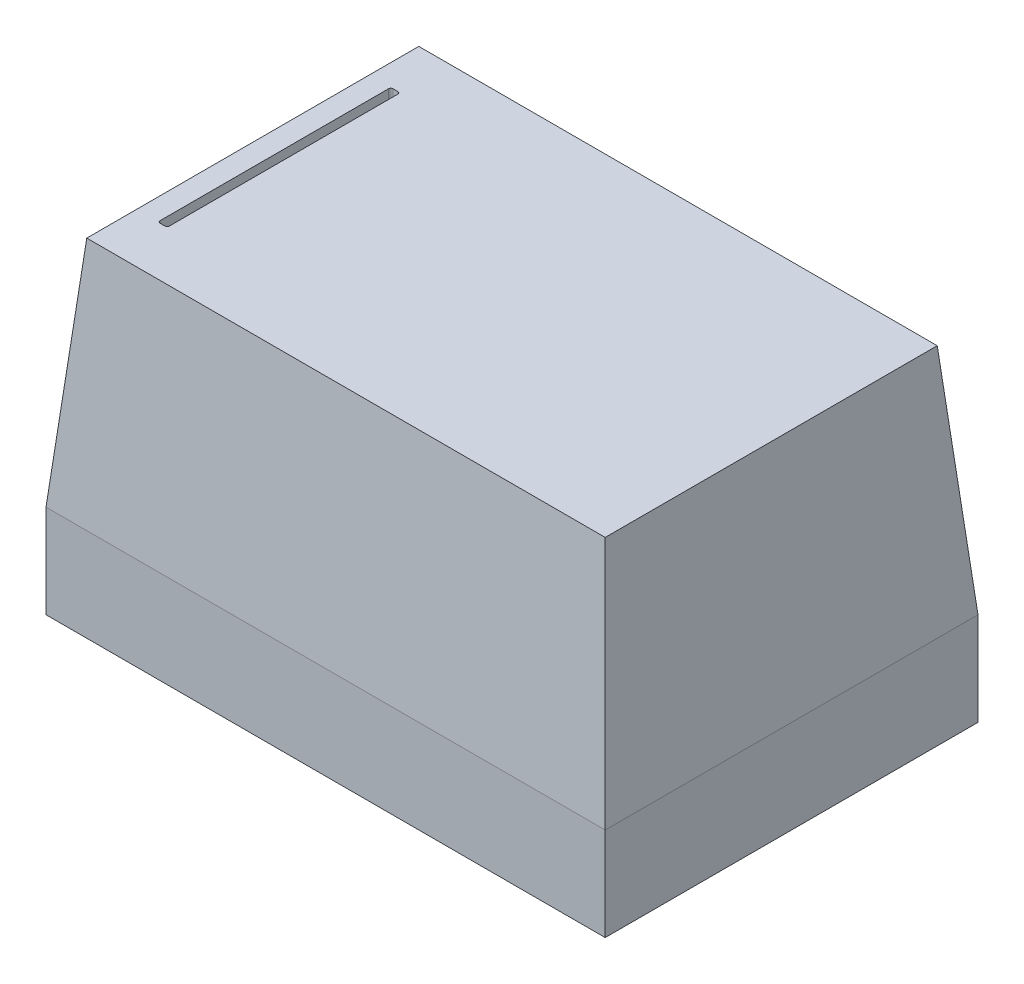
ISO-10303-21;
HEADER;
FILE_DESCRIPTION(('STEP AP214'),'2;1');
FILE_NAME('part.step','',(''),(''),'','','');
FILE_SCHEMA(('AUTOMOTIVE_DESIGN { 1 0 10303 214 1 1 1 1 }'));
ENDSEC;
DATA;
#1=APPLICATION_CONTEXT('core data for automotive mechanical design processes');
#2=APPLICATION_PROTOCOL_DEFINITION('international standard','automotive_design',2000,#1);
#3=PRODUCT_CONTEXT('',#1,'mechanical');
#4=PRODUCT('Part','Part','',(#3));
#5=PRODUCT_RELATED_PRODUCT_CATEGORY('part','',(#4));
#6=PRODUCT_DEFINITION_FORMATION('','',#4);
#7=PRODUCT_DEFINITION_CONTEXT('part definition',#1,'design');
#8=PRODUCT_DEFINITION('design','',#6,#7);
#9=PRODUCT_DEFINITION_SHAPE('','',#8);
#10=(LENGTH_UNIT() NAMED_UNIT(*) SI_UNIT(.MILLI.,.METRE.));
#11=(NAMED_UNIT(*) PLANE_ANGLE_UNIT() SI_UNIT($,.RADIAN.));
#12=(NAMED_UNIT(*) SI_UNIT($,.STERADIAN.) SOLID_ANGLE_UNIT());
#13=UNCERTAINTY_MEASURE_WITH_UNIT(LENGTH_MEASURE(1.E-05),#10,'distance_accuracy_value','');
#14=(GEOMETRIC_REPRESENTATION_CONTEXT(3) GLOBAL_UNCERTAINTY_ASSIGNED_CONTEXT((#13)) GLOBAL_UNIT_ASSIGNED_CONTEXT((#10,
#11,#12)) REPRESENTATION_CONTEXT('',''));
#15=CARTESIAN_POINT('',(0.,0.,0.));
#16=DIRECTION('',(0.,0.,1.));
#17=DIRECTION('',(1.,0.,0.));
#18=AXIS2_PLACEMENT_3D('',#15,#16,#17);
#19=CARTESIAN_POINT('',(-0.495,0.65,0.245));
#20=DIRECTION('',(0.,1.,0.));
#21=DIRECTION('',(0.,0.,1.));
#22=AXIS2_PLACEMENT_3D('',#19,#20,#21);
#23=PLANE('',#22);
#24=CARTESIAN_POINT('',(-0.505,0.65,0.245));
#25=DIRECTION('',(0.,1.,0.));
#26=DIRECTION('',(0.,0.,1.));
#27=AXIS2_PLACEMENT_3D('',#24,#25,#26);
#28=CIRCLE('',#27,0.005);
#29=CARTESIAN_POINT('',(-0.51,0.65,0.245));
#30=VERTEX_POINT('',#29);
#31=CARTESIAN_POINT('',(-0.505,0.65,0.25));
#32=VERTEX_POINT('',#31);
#33=EDGE_CURVE('E132',#30,#32,#28,.T.);
#34=ORIENTED_EDGE('',*,*,#33,.T.);
#35=DIRECTION('',(1.,0.,0.));
#36=VECTOR('',#35,1.);
#37=CARTESIAN_POINT('',(-0.505,0.65,0.25));
#38=LINE('',#37,#36);
#39=CARTESIAN_POINT('',(-0.495,0.65,0.25));
#40=VERTEX_POINT('',#39);
#41=EDGE_CURVE('E126',#32,#40,#38,.T.);
#42=ORIENTED_EDGE('',*,*,#41,.T.);
#43=CARTESIAN_POINT('',(-0.495,0.65,0.245));
#44=DIRECTION('',(0.,1.,0.));
#45=DIRECTION('',(0.,0.,1.));
#46=AXIS2_PLACEMENT_3D('',#43,#44,#45);
#47=CIRCLE('',#46,0.005);
#48=CARTESIAN_POINT('',(-0.49,0.65,0.245));
#49=VERTEX_POINT('',#48);
#50=EDGE_CURVE('E20',#40,#49,#47,.T.);
#51=ORIENTED_EDGE('',*,*,#50,.T.);
#52=DIRECTION('',(0.,0.,-1.));
#53=VECTOR('',#52,1.);
#54=CARTESIAN_POINT('',(-0.49,0.65,-0.245));
#55=LINE('',#54,#53);
#56=CARTESIAN_POINT('',(-0.49,0.65,-0.245));
#57=VERTEX_POINT('',#56);
#58=EDGE_CURVE('E168',#49,#57,#55,.T.);
#59=ORIENTED_EDGE('',*,*,#58,.T.);
#60=CARTESIAN_POINT('',(-0.495,0.65,-0.245));
#61=DIRECTION('',(0.,1.,0.));
#62=DIRECTION('',(0.,0.,1.));
#63=AXIS2_PLACEMENT_3D('',#60,#61,#62);
#64=CIRCLE('',#63,0.005);
#65=CARTESIAN_POINT('',(-0.495,0.65,-0.25));
#66=VERTEX_POINT('',#65);
#67=EDGE_CURVE('E153',#57,#66,#64,.T.);
#68=ORIENTED_EDGE('',*,*,#67,.T.);
#69=DIRECTION('',(-1.,0.,0.));
#70=VECTOR('',#69,1.);
#71=CARTESIAN_POINT('',(-0.505,0.65,-0.25));
#72=LINE('',#71,#70);
#73=CARTESIAN_POINT('',(-0.505,0.65,-0.25));
#74=VERTEX_POINT('',#73);
#75=EDGE_CURVE('E169',#66,#74,#72,.T.);
#76=ORIENTED_EDGE('',*,*,#75,.T.);
#77=CARTESIAN_POINT('',(-0.505,0.65,-0.245));
#78=DIRECTION('',(0.,1.,0.));
#79=DIRECTION('',(0.,0.,1.));
#80=AXIS2_PLACEMENT_3D('',#77,#78,#79);
#81=CIRCLE('',#80,0.005);
#82=CARTESIAN_POINT('',(-0.51,0.65,-0.245));
#83=VERTEX_POINT('',#82);
#84=EDGE_CURVE('E158',#74,#83,#81,.T.);
#85=ORIENTED_EDGE('',*,*,#84,.T.);
#86=DIRECTION('',(0.,0.,1.));
#87=VECTOR('',#86,1.);
#88=CARTESIAN_POINT('',(-0.51,0.65,-0.245));
#89=LINE('',#88,#87);
#90=EDGE_CURVE('E139',#83,#30,#89,.T.);
#91=ORIENTED_EDGE('',*,*,#90,.T.);
#92=EDGE_LOOP('',(#34,#42,#51,#59,#68,#76,#85,#91));
#93=FACE_BOUND('',#92,.T.);
#94=ADVANCED_FACE('F17',(#93),#23,.T.);
#95=CARTESIAN_POINT('',(-0.495,0.65,0.245));
#96=DIRECTION('',(0.,1.,0.));
#97=DIRECTION('',(0.,0.,1.));
#98=AXIS2_PLACEMENT_3D('',#95,#96,#97);
#99=CYLINDRICAL_SURFACE('',#98,0.005);
#100=DIRECTION('',(0.,1.,0.));
#101=VECTOR('',#100,1.);
#102=CARTESIAN_POINT('',(-0.49,0.65,0.245));
#103=LINE('',#102,#101);
#104=CARTESIAN_POINT('',(-0.49,0.7,0.245));
#105=VERTEX_POINT('',#104);
#106=EDGE_CURVE('E121',#105,#49,#103,.F.);
#107=ORIENTED_EDGE('',*,*,#106,.T.);
#108=ORIENTED_EDGE('',*,*,#50,.F.);
#109=DIRECTION('',(0.,1.,0.));
#110=VECTOR('',#109,1.);
#111=CARTESIAN_POINT('',(-0.495,0.65,0.25));
#112=LINE('',#111,#110);
#113=CARTESIAN_POINT('',(-0.495,0.7,0.25));
#114=VERTEX_POINT('',#113);
#115=EDGE_CURVE('E119',#40,#114,#112,.T.);
#116=ORIENTED_EDGE('',*,*,#115,.T.);
#117=CARTESIAN_POINT('',(-0.495,0.7,0.245));
#118=DIRECTION('',(0.,1.,0.));
#119=DIRECTION('',(0.,0.,1.));
#120=AXIS2_PLACEMENT_3D('',#117,#118,#119);
#121=CIRCLE('',#120,0.005);
#122=EDGE_CURVE('E150',#105,#114,#121,.F.);
#123=ORIENTED_EDGE('',*,*,#122,.F.);
#124=EDGE_LOOP('',(#107,#108,#116,#123));
#125=FACE_BOUND('',#124,.T.);
#126=ADVANCED_FACE('F117',(#125),#99,.F.);
#127=CARTESIAN_POINT('',(-0.505,0.65,0.25));
#128=DIRECTION('',(0.,0.,1.));
#129=DIRECTION('',(1.,0.,0.));
#130=AXIS2_PLACEMENT_3D('',#127,#128,#129);
#131=PLANE('',#130);
#132=ORIENTED_EDGE('',*,*,#115,.F.);
#133=ORIENTED_EDGE('',*,*,#41,.F.);
#134=DIRECTION('',(0.,1.,0.));
#135=VECTOR('',#134,1.);
#136=CARTESIAN_POINT('',(-0.505,0.65,0.25));
#137=LINE('',#136,#135);
#138=CARTESIAN_POINT('',(-0.505,0.7,0.25));
#139=VERTEX_POINT('',#138);
#140=EDGE_CURVE('E162',#32,#139,#137,.T.);
#141=ORIENTED_EDGE('',*,*,#140,.T.);
#142=DIRECTION('',(1.,0.,0.));
#143=VECTOR('',#142,1.);
#144=CARTESIAN_POINT('',(0.,0.7,0.25));
#145=LINE('',#144,#143);
#146=EDGE_CURVE('E131',#114,#139,#145,.F.);
#147=ORIENTED_EDGE('',*,*,#146,.F.);
#148=EDGE_LOOP('',(#132,#133,#141,#147));
#149=FACE_BOUND('',#148,.T.);
#150=ADVANCED_FACE('F128',(#149),#131,.F.);
#151=CARTESIAN_POINT('',(-0.505,0.65,0.245));
#152=DIRECTION('',(0.,1.,0.));
#153=DIRECTION('',(0.,0.,1.));
#154=AXIS2_PLACEMENT_3D('',#151,#152,#153);
#155=CYLINDRICAL_SURFACE('',#154,0.005);
#156=ORIENTED_EDGE('',*,*,#140,.F.);
#157=ORIENTED_EDGE('',*,*,#33,.F.);
#158=DIRECTION('',(0.,1.,0.));
#159=VECTOR('',#158,1.);
#160=CARTESIAN_POINT('',(-0.51,0.65,0.245));
#161=LINE('',#160,#159);
#162=CARTESIAN_POINT('',(-0.51,0.7,0.245));
#163=VERTEX_POINT('',#162);
#164=EDGE_CURVE('E161',#30,#163,#161,.T.);
#165=ORIENTED_EDGE('',*,*,#164,.T.);
#166=CARTESIAN_POINT('',(-0.505,0.7,0.245));
#167=DIRECTION('',(0.,1.,0.));
#168=DIRECTION('',(0.,0.,1.));
#169=AXIS2_PLACEMENT_3D('',#166,#167,#168);
#170=CIRCLE('',#169,0.005);
#171=EDGE_CURVE('E148',#139,#163,#170,.F.);
#172=ORIENTED_EDGE('',*,*,#171,.F.);
#173=EDGE_LOOP('',(#156,#157,#165,#172));
#174=FACE_BOUND('',#173,.T.);
#175=ADVANCED_FACE('F303',(#174),#155,.F.);
#176=CARTESIAN_POINT('',(-0.51,0.65,-0.245));
#177=DIRECTION('',(-1.,0.,0.));
#178=DIRECTION('',(0.,0.,1.));
#179=AXIS2_PLACEMENT_3D('',#176,#177,#178);
#180=PLANE('',#179);
#181=ORIENTED_EDGE('',*,*,#164,.F.);
#182=ORIENTED_EDGE('',*,*,#90,.F.);
#183=DIRECTION('',(0.,1.,0.));
#184=VECTOR('',#183,1.);
#185=CARTESIAN_POINT('',(-0.51,0.65,-0.245));
#186=LINE('',#185,#184);
#187=CARTESIAN_POINT('',(-0.51,0.7,-0.245));
#188=VERTEX_POINT('',#187);
#189=EDGE_CURVE('E160',#83,#188,#186,.T.);
#190=ORIENTED_EDGE('',*,*,#189,.T.);
#191=DIRECTION('',(0.,0.,1.));
#192=VECTOR('',#191,1.);
#193=CARTESIAN_POINT('',(-0.51,0.7,0.));
#194=LINE('',#193,#192);
#195=EDGE_CURVE('E147',#163,#188,#194,.F.);
#196=ORIENTED_EDGE('',*,*,#195,.F.);
#197=EDGE_LOOP('',(#181,#182,#190,#196));
#198=FACE_BOUND('',#197,.T.);
#199=ADVANCED_FACE('F299',(#198),#180,.F.);
#200=CARTESIAN_POINT('',(-0.505,0.65,-0.245));
#201=DIRECTION('',(0.,1.,0.));
#202=DIRECTION('',(0.,0.,1.));
#203=AXIS2_PLACEMENT_3D('',#200,#201,#202);
#204=CYLINDRICAL_SURFACE('',#203,0.005);
#205=ORIENTED_EDGE('',*,*,#189,.F.);
#206=ORIENTED_EDGE('',*,*,#84,.F.);
#207=DIRECTION('',(0.,1.,0.));
#208=VECTOR('',#207,1.);
#209=CARTESIAN_POINT('',(-0.505,0.65,-0.25));
#210=LINE('',#209,#208);
#211=CARTESIAN_POINT('',(-0.505,0.7,-0.25));
#212=VERTEX_POINT('',#211);
#213=EDGE_CURVE('E157',#74,#212,#210,.T.);
#214=ORIENTED_EDGE('',*,*,#213,.T.);
#215=CARTESIAN_POINT('',(-0.505,0.7,-0.245));
#216=DIRECTION('',(0.,1.,0.));
#217=DIRECTION('',(0.,0.,1.));
#218=AXIS2_PLACEMENT_3D('',#215,#216,#217);
#219=CIRCLE('',#218,0.005);
#220=EDGE_CURVE('E145',#188,#212,#219,.F.);
#221=ORIENTED_EDGE('',*,*,#220,.F.);
#222=EDGE_LOOP('',(#205,#206,#214,#221));
#223=FACE_BOUND('',#222,.T.);
#224=ADVANCED_FACE('F295',(#223),#204,.F.);
#225=CARTESIAN_POINT('',(-0.505,0.65,-0.25));
#226=DIRECTION('',(0.,0.,-1.));
#227=DIRECTION('',(-1.,0.,0.));
#228=AXIS2_PLACEMENT_3D('',#225,#226,#227);
#229=PLANE('',#228);
#230=ORIENTED_EDGE('',*,*,#213,.F.);
#231=ORIENTED_EDGE('',*,*,#75,.F.);
#232=DIRECTION('',(0.,1.,0.));
#233=VECTOR('',#232,1.);
#234=CARTESIAN_POINT('',(-0.495,0.65,-0.25));
#235=LINE('',#234,#233);
#236=CARTESIAN_POINT('',(-0.495,0.7,-0.25));
#237=VERTEX_POINT('',#236);
#238=EDGE_CURVE('E156',#66,#237,#235,.T.);
#239=ORIENTED_EDGE('',*,*,#238,.T.);
#240=DIRECTION('',(1.,0.,0.));
#241=VECTOR('',#240,1.);
#242=CARTESIAN_POINT('',(0.,0.7,-0.25));
#243=LINE('',#242,#241);
#244=EDGE_CURVE('E144',#212,#237,#243,.T.);
#245=ORIENTED_EDGE('',*,*,#244,.F.);
#246=EDGE_LOOP('',(#230,#231,#239,#245));
#247=FACE_BOUND('',#246,.T.);
#248=ADVANCED_FACE('F291',(#247),#229,.F.);
#249=CARTESIAN_POINT('',(-0.495,0.65,-0.245));
#250=DIRECTION('',(0.,1.,0.));
#251=DIRECTION('',(0.,0.,1.));
#252=AXIS2_PLACEMENT_3D('',#249,#250,#251);
#253=CYLINDRICAL_SURFACE('',#252,0.005);
#254=ORIENTED_EDGE('',*,*,#238,.F.);
#255=ORIENTED_EDGE('',*,*,#67,.F.);
#256=DIRECTION('',(0.,1.,0.));
#257=VECTOR('',#256,1.);
#258=CARTESIAN_POINT('',(-0.49,0.65,-0.245));
#259=LINE('',#258,#257);
#260=CARTESIAN_POINT('',(-0.49,0.7,-0.245));
#261=VERTEX_POINT('',#260);
#262=EDGE_CURVE('E152',#57,#261,#259,.T.);
#263=ORIENTED_EDGE('',*,*,#262,.T.);
#264=CARTESIAN_POINT('',(-0.495,0.7,-0.245));
#265=DIRECTION('',(0.,1.,0.));
#266=DIRECTION('',(0.,0.,1.));
#267=AXIS2_PLACEMENT_3D('',#264,#265,#266);
#268=CIRCLE('',#267,0.005);
#269=EDGE_CURVE('E141',#237,#261,#268,.F.);
#270=ORIENTED_EDGE('',*,*,#269,.F.);
#271=EDGE_LOOP('',(#254,#255,#263,#270));
#272=FACE_BOUND('',#271,.T.);
#273=ADVANCED_FACE('F287',(#272),#253,.F.);
#274=CARTESIAN_POINT('',(-0.49,0.65,-0.245));
#275=DIRECTION('',(1.,0.,0.));
#276=DIRECTION('',(0.,0.,-1.));
#277=AXIS2_PLACEMENT_3D('',#274,#275,#276);
#278=PLANE('',#277);
#279=ORIENTED_EDGE('',*,*,#262,.F.);
#280=ORIENTED_EDGE('',*,*,#58,.F.);
#281=ORIENTED_EDGE('',*,*,#106,.F.);
#282=DIRECTION('',(0.,0.,1.));
#283=VECTOR('',#282,1.);
#284=CARTESIAN_POINT('',(-0.49,0.7,0.));
#285=LINE('',#284,#283);
#286=EDGE_CURVE('E143',#261,#105,#285,.T.);
#287=ORIENTED_EDGE('',*,*,#286,.F.);
#288=EDGE_LOOP('',(#279,#280,#281,#287));
#289=FACE_BOUND('',#288,.T.);
#290=ADVANCED_FACE('F283',(#289),#278,.F.);
#291=CARTESIAN_POINT('',(0.,0.7,0.));
#292=DIRECTION('',(0.,1.,0.));
#293=DIRECTION('',(0.,0.,1.));
#294=AXIS2_PLACEMENT_3D('',#291,#292,#293);
#295=PLANE('',#294);
#296=DIRECTION('',(1.,0.,0.));
#297=VECTOR('',#296,1.);
#298=CARTESIAN_POINT('',(0.6,0.700000000000004,-0.356255668237048));
#299=LINE('',#298,#297);
#300=CARTESIAN_POINT('',(-0.556255668237012,0.700000000000002,-0.356255668237012));
#301=VERTEX_POINT('',#300);
#302=CARTESIAN_POINT('',(0.556255668237012,0.700000000000003,-0.356255668237024));
#303=VERTEX_POINT('',#302);
#304=EDGE_CURVE('E189',#301,#303,#299,.T.);
#305=ORIENTED_EDGE('',*,*,#304,.F.);
#306=DIRECTION('',(0.,0.,1.));
#307=VECTOR('',#306,1.);
#308=CARTESIAN_POINT('',(-0.556255668237048,0.700000000000004,-0.4));
#309=LINE('',#308,#307);
#310=CARTESIAN_POINT('',(-0.556255668237012,0.700000000000002,0.356255668237012));
#311=VERTEX_POINT('',#310);
#312=EDGE_CURVE('E191',#311,#301,#309,.F.);
#313=ORIENTED_EDGE('',*,*,#312,.F.);
#314=DIRECTION('',(1.,0.,0.));
#315=VECTOR('',#314,1.);
#316=CARTESIAN_POINT('',(-0.6,0.700000000000004,0.356255668237048));
#317=LINE('',#316,#315);
#318=CARTESIAN_POINT('',(0.556255668237012,0.700000000000002,0.356255668237012));
#319=VERTEX_POINT('',#318);
#320=EDGE_CURVE('E195',#319,#311,#317,.F.);
#321=ORIENTED_EDGE('',*,*,#320,.F.);
#322=DIRECTION('',(0.,0.,1.));
#323=VECTOR('',#322,1.);
#324=CARTESIAN_POINT('',(0.556255668237048,0.700000000000004,0.4));
#325=LINE('',#324,#323);
#326=EDGE_CURVE('E202',#303,#319,#325,.T.);
#327=ORIENTED_EDGE('',*,*,#326,.F.);
#328=EDGE_LOOP('',(#305,#313,#321,#327));
#329=FACE_BOUND('',#328,.T.);
#330=ORIENTED_EDGE('',*,*,#269,.T.);
#331=ORIENTED_EDGE('',*,*,#286,.T.);
#332=ORIENTED_EDGE('',*,*,#122,.T.);
#333=ORIENTED_EDGE('',*,*,#146,.T.);
#334=ORIENTED_EDGE('',*,*,#171,.T.);
#335=ORIENTED_EDGE('',*,*,#195,.T.);
#336=ORIENTED_EDGE('',*,*,#220,.T.);
#337=ORIENTED_EDGE('',*,*,#244,.T.);
#338=EDGE_LOOP('',(#330,#331,#332,#333,#334,#335,#336,#337));
#339=FACE_BOUND('',#338,.T.);
#340=ADVANCED_FACE('F279',(#329,#339),#295,.T.);
#341=CARTESIAN_POINT('',(0.6,0.2,-0.4));
#342=DIRECTION('',(0.,0.0871557427476379,-0.996194698091747));
#343=DIRECTION('',(0.,0.996194698091747,0.0871557427476379));
#344=AXIS2_PLACEMENT_3D('',#341,#342,#343);
#345=PLANE('',#344);
#346=ORIENTED_EDGE('',*,*,#304,.T.);
#347=DIRECTION('',(-0.0868265938642269,0.992432509138963,0.086826593864322));
#348=VECTOR('',#347,1.);
#349=CARTESIAN_POINT('',(0.6,0.2,-0.4));
#350=LINE('',#349,#348);
#351=CARTESIAN_POINT('',(0.6,0.2,-0.4));
#352=VERTEX_POINT('',#351);
#353=EDGE_CURVE('E199',#352,#303,#350,.T.);
#354=ORIENTED_EDGE('',*,*,#353,.F.);
#355=DIRECTION('',(1.,0.,0.));
#356=VECTOR('',#355,1.);
#357=CARTESIAN_POINT('',(-0.6,0.2,-0.4));
#358=LINE('',#357,#356);
#359=CARTESIAN_POINT('',(-0.6,0.2,-0.4));
#360=VERTEX_POINT('',#359);
#361=EDGE_CURVE('E206',#352,#360,#358,.F.);
#362=ORIENTED_EDGE('',*,*,#361,.T.);
#363=DIRECTION('',(-0.0868265938642269,-0.992432509138963,-0.0868265938643219));
#364=VECTOR('',#363,1.);
#365=CARTESIAN_POINT('',(-0.556255668237048,0.700000000000004,-0.356255668237));
#366=LINE('',#365,#364);
#367=EDGE_CURVE('E193',#301,#360,#366,.T.);
#368=ORIENTED_EDGE('',*,*,#367,.F.);
#369=EDGE_LOOP('',(#346,#354,#362,#368));
#370=FACE_BOUND('',#369,.T.);
#371=ADVANCED_FACE('F275',(#370),#345,.T.);
#372=CARTESIAN_POINT('',(-0.6,0.2,-0.4));
#373=DIRECTION('',(-0.996194698091747,0.0871557427476379,0.));
#374=DIRECTION('',(-0.0871557427476379,-0.996194698091747,0.));
#375=AXIS2_PLACEMENT_3D('',#372,#373,#374);
#376=PLANE('',#375);
#377=ORIENTED_EDGE('',*,*,#312,.T.);
#378=ORIENTED_EDGE('',*,*,#367,.T.);
#379=DIRECTION('',(0.,0.,-1.));
#380=VECTOR('',#379,1.);
#381=CARTESIAN_POINT('',(-0.6,0.2,-0.4));
#382=LINE('',#381,#380);
#383=CARTESIAN_POINT('',(-0.6,0.2,0.4));
#384=VERTEX_POINT('',#383);
#385=EDGE_CURVE('E212',#360,#384,#382,.F.);
#386=ORIENTED_EDGE('',*,*,#385,.T.);
#387=DIRECTION('',(-0.0868265938643218,-0.992432509138963,0.0868265938642268));
#388=VECTOR('',#387,1.);
#389=CARTESIAN_POINT('',(-0.556255668237,0.700000000000004,0.356255668237048));
#390=LINE('',#389,#388);
#391=EDGE_CURVE('E197',#311,#384,#390,.T.);
#392=ORIENTED_EDGE('',*,*,#391,.F.);
#393=EDGE_LOOP('',(#377,#378,#386,#392));
#394=FACE_BOUND('',#393,.T.);
#395=ADVANCED_FACE('F271',(#394),#376,.T.);
#396=CARTESIAN_POINT('',(-0.6,0.2,0.4));
#397=DIRECTION('',(0.,0.0871557427476379,0.996194698091747));
#398=DIRECTION('',(0.,-0.996194698091747,0.0871557427476379));
#399=AXIS2_PLACEMENT_3D('',#396,#397,#398);
#400=PLANE('',#399);
#401=ORIENTED_EDGE('',*,*,#320,.T.);
#402=ORIENTED_EDGE('',*,*,#391,.T.);
#403=DIRECTION('',(-1.,0.,0.));
#404=VECTOR('',#403,1.);
#405=CARTESIAN_POINT('',(-0.6,0.2,0.4));
#406=LINE('',#405,#404);
#407=CARTESIAN_POINT('',(0.6,0.2,0.4));
#408=VERTEX_POINT('',#407);
#409=EDGE_CURVE('E218',#384,#408,#406,.F.);
#410=ORIENTED_EDGE('',*,*,#409,.T.);
#411=DIRECTION('',(0.0868265938642269,-0.992432509138963,0.0868265938643219));
#412=VECTOR('',#411,1.);
#413=CARTESIAN_POINT('',(0.556255668237048,0.700000000000004,0.356255668237));
#414=LINE('',#413,#412);
#415=EDGE_CURVE('E204',#319,#408,#414,.T.);
#416=ORIENTED_EDGE('',*,*,#415,.F.);
#417=EDGE_LOOP('',(#401,#402,#410,#416));
#418=FACE_BOUND('',#417,.T.);
#419=ADVANCED_FACE('F267',(#418),#400,.T.);
#420=CARTESIAN_POINT('',(0.6,0.2,0.4));
#421=DIRECTION('',(0.996194698091747,0.0871557427476379,0.));
#422=DIRECTION('',(-0.0871557427476379,0.996194698091747,0.));
#423=AXIS2_PLACEMENT_3D('',#420,#421,#422);
#424=PLANE('',#423);
#425=ORIENTED_EDGE('',*,*,#326,.T.);
#426=ORIENTED_EDGE('',*,*,#415,.T.);
#427=DIRECTION('',(0.,0.,1.));
#428=VECTOR('',#427,1.);
#429=CARTESIAN_POINT('',(0.6,0.2,-0.4));
#430=LINE('',#429,#428);
#431=EDGE_CURVE('E222',#408,#352,#430,.F.);
#432=ORIENTED_EDGE('',*,*,#431,.T.);
#433=ORIENTED_EDGE('',*,*,#353,.T.);
#434=EDGE_LOOP('',(#425,#426,#432,#433));
#435=FACE_BOUND('',#434,.T.);
#436=ADVANCED_FACE('F264',(#435),#424,.T.);
#437=CARTESIAN_POINT('',(-0.6,0.2,-0.4));
#438=DIRECTION('',(0.,0.,1.));
#439=DIRECTION('',(1.,0.,0.));
#440=AXIS2_PLACEMENT_3D('',#437,#438,#439);
#441=PLANE('',#440);
#442=DIRECTION('',(0.,1.,0.));
#443=VECTOR('',#442,1.);
#444=CARTESIAN_POINT('',(-0.6,0.2,-0.4));
#445=LINE('',#444,#443);
#446=CARTESIAN_POINT('',(-0.6,0.,-0.4));
#447=VERTEX_POINT('',#446);
#448=EDGE_CURVE('E209',#447,#360,#445,.T.);
#449=ORIENTED_EDGE('',*,*,#448,.T.);
#450=ORIENTED_EDGE('',*,*,#361,.F.);
#451=DIRECTION('',(0.,1.,0.));
#452=VECTOR('',#451,1.);
#453=CARTESIAN_POINT('',(0.6,0.2,-0.4));
#454=LINE('',#453,#452);
#455=CARTESIAN_POINT('',(0.6,0.,-0.4));
#456=VERTEX_POINT('',#455);
#457=EDGE_CURVE('E225',#352,#456,#454,.F.);
#458=ORIENTED_EDGE('',*,*,#457,.T.);
#459=DIRECTION('',(1.,0.,0.));
#460=VECTOR('',#459,1.);
#461=CARTESIAN_POINT('',(0.,0.,-0.4));
#462=LINE('',#461,#460);
#463=EDGE_CURVE('E228',#456,#447,#462,.F.);
#464=ORIENTED_EDGE('',*,*,#463,.T.);
#465=EDGE_LOOP('',(#449,#450,#458,#464));
#466=FACE_BOUND('',#465,.T.);
#467=ADVANCED_FACE('F246',(#466),#441,.F.);
#468=CARTESIAN_POINT('',(-0.6,0.2,-0.4));
#469=DIRECTION('',(1.,0.,0.));
#470=DIRECTION('',(0.,0.,-1.));
#471=AXIS2_PLACEMENT_3D('',#468,#469,#470);
#472=PLANE('',#471);
#473=DIRECTION('',(0.,1.,0.));
#474=VECTOR('',#473,1.);
#475=CARTESIAN_POINT('',(-0.6,0.2,0.4));
#476=LINE('',#475,#474);
#477=CARTESIAN_POINT('',(-0.6,0.,0.4));
#478=VERTEX_POINT('',#477);
#479=EDGE_CURVE('E215',#478,#384,#476,.T.);
#480=ORIENTED_EDGE('',*,*,#479,.T.);
#481=ORIENTED_EDGE('',*,*,#385,.F.);
#482=ORIENTED_EDGE('',*,*,#448,.F.);
#483=DIRECTION('',(0.,0.,1.));
#484=VECTOR('',#483,1.);
#485=CARTESIAN_POINT('',(-0.6,0.,0.));
#486=LINE('',#485,#484);
#487=EDGE_CURVE('E231',#447,#478,#486,.T.);
#488=ORIENTED_EDGE('',*,*,#487,.T.);
#489=EDGE_LOOP('',(#480,#481,#482,#488));
#490=FACE_BOUND('',#489,.T.);
#491=ADVANCED_FACE('F243',(#490),#472,.F.);
#492=CARTESIAN_POINT('',(-0.6,0.2,0.4));
#493=DIRECTION('',(0.,0.,-1.));
#494=DIRECTION('',(-1.,0.,0.));
#495=AXIS2_PLACEMENT_3D('',#492,#493,#494);
#496=PLANE('',#495);
#497=DIRECTION('',(0.,1.,0.));
#498=VECTOR('',#497,1.);
#499=CARTESIAN_POINT('',(0.6,0.2,0.4));
#500=LINE('',#499,#498);
#501=CARTESIAN_POINT('',(0.6,0.,0.4));
#502=VERTEX_POINT('',#501);
#503=EDGE_CURVE('E34',#502,#408,#500,.T.);
#504=ORIENTED_EDGE('',*,*,#503,.T.);
#505=ORIENTED_EDGE('',*,*,#409,.F.);
#506=ORIENTED_EDGE('',*,*,#479,.F.);
#507=DIRECTION('',(1.,0.,0.));
#508=VECTOR('',#507,1.);
#509=CARTESIAN_POINT('',(0.,0.,0.4));
#510=LINE('',#509,#508);
#511=EDGE_CURVE('E26',#478,#502,#510,.T.);
#512=ORIENTED_EDGE('',*,*,#511,.T.);
#513=EDGE_LOOP('',(#504,#505,#506,#512));
#514=FACE_BOUND('',#513,.T.);
#515=ADVANCED_FACE('F237',(#514),#496,.F.);
#516=CARTESIAN_POINT('',(0.6,0.2,-0.4));
#517=DIRECTION('',(-1.,0.,0.));
#518=DIRECTION('',(0.,0.,1.));
#519=AXIS2_PLACEMENT_3D('',#516,#517,#518);
#520=PLANE('',#519);
#521=ORIENTED_EDGE('',*,*,#457,.F.);
#522=ORIENTED_EDGE('',*,*,#431,.F.);
#523=ORIENTED_EDGE('',*,*,#503,.F.);
#524=DIRECTION('',(0.,0.,1.));
#525=VECTOR('',#524,1.);
#526=CARTESIAN_POINT('',(0.6,0.,0.));
#527=LINE('',#526,#525);
#528=EDGE_CURVE('E11',#502,#456,#527,.F.);
#529=ORIENTED_EDGE('',*,*,#528,.T.);
#530=EDGE_LOOP('',(#521,#522,#523,#529));
#531=FACE_BOUND('',#530,.T.);
#532=ADVANCED_FACE('F249',(#531),#520,.F.);
#533=CARTESIAN_POINT('',(0.,0.,0.));
#534=DIRECTION('',(0.,1.,0.));
#535=DIRECTION('',(0.,0.,1.));
#536=AXIS2_PLACEMENT_3D('',#533,#534,#535);
#537=PLANE('',#536);
#538=ORIENTED_EDGE('',*,*,#511,.F.);
#539=ORIENTED_EDGE('',*,*,#487,.F.);
#540=ORIENTED_EDGE('',*,*,#463,.F.);
#541=ORIENTED_EDGE('',*,*,#528,.F.);
#542=EDGE_LOOP('',(#538,#539,#540,#541));
#543=FACE_BOUND('',#542,.T.);
#544=ADVANCED_FACE('F241',(#543),#537,.F.);
#545=CLOSED_SHELL('',(#94,#126,#150,#175,#199,#224,#248,#273,#290,#340,#371,#395,#419,#436,#467,
#491,#515,#532,#544));
#546=MANIFOLD_SOLID_BREP('B1',#545);
#547=ADVANCED_BREP_SHAPE_REPRESENTATION('',(#18,#546),#14);
#548=SHAPE_DEFINITION_REPRESENTATION(#9,#547);
ENDSEC;
END-ISO-10303-21;
